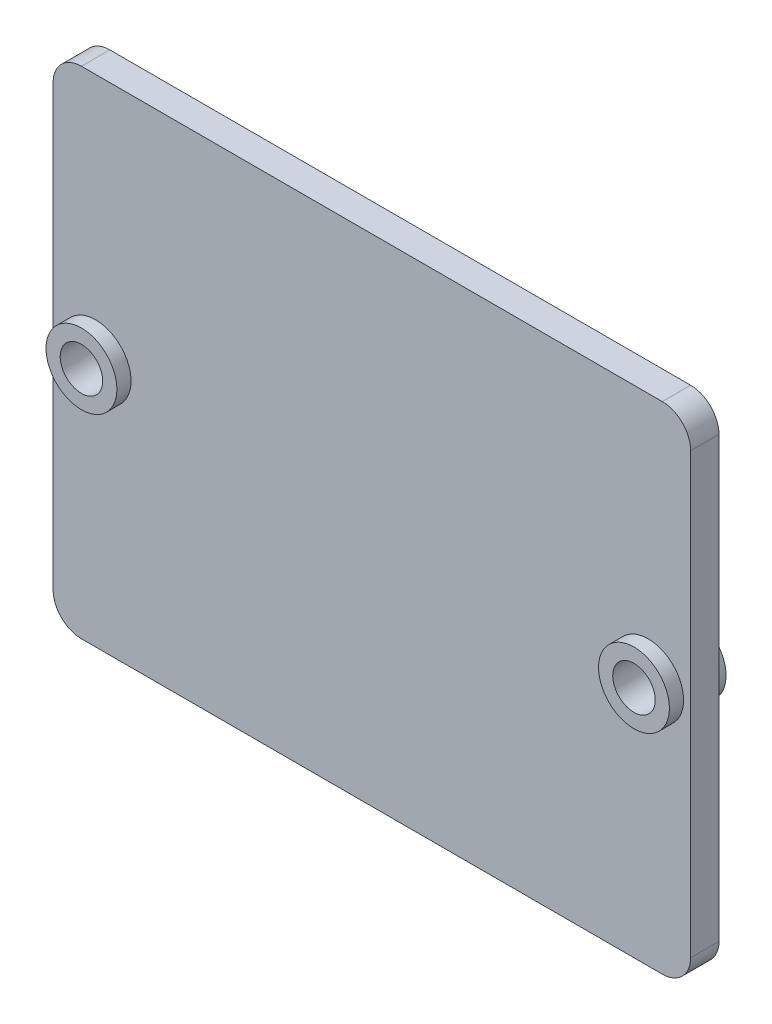
ISO-10303-21;
HEADER;
FILE_DESCRIPTION(('STEP AP214'),'2;1');
FILE_NAME('part.step','',(''),(''),'','','');
FILE_SCHEMA(('AUTOMOTIVE_DESIGN { 1 0 10303 214 1 1 1 1 }'));
ENDSEC;
DATA;
#1=APPLICATION_CONTEXT('core data for automotive mechanical design processes');
#2=APPLICATION_PROTOCOL_DEFINITION('international standard','automotive_design',2000,#1);
#3=PRODUCT_CONTEXT('',#1,'mechanical');
#4=PRODUCT('Part','Part','',(#3));
#5=PRODUCT_RELATED_PRODUCT_CATEGORY('part','',(#4));
#6=PRODUCT_DEFINITION_FORMATION('','',#4);
#7=PRODUCT_DEFINITION_CONTEXT('part definition',#1,'design');
#8=PRODUCT_DEFINITION('design','',#6,#7);
#9=PRODUCT_DEFINITION_SHAPE('','',#8);
#10=(LENGTH_UNIT() NAMED_UNIT(*) SI_UNIT(.MILLI.,.METRE.));
#11=(NAMED_UNIT(*) PLANE_ANGLE_UNIT() SI_UNIT($,.RADIAN.));
#12=(NAMED_UNIT(*) SI_UNIT($,.STERADIAN.) SOLID_ANGLE_UNIT());
#13=UNCERTAINTY_MEASURE_WITH_UNIT(LENGTH_MEASURE(1.E-05),#10,'distance_accuracy_value','');
#14=(GEOMETRIC_REPRESENTATION_CONTEXT(3) GLOBAL_UNCERTAINTY_ASSIGNED_CONTEXT((#13)) GLOBAL_UNIT_ASSIGNED_CONTEXT((#10,
#11,#12)) REPRESENTATION_CONTEXT('',''));
#15=CARTESIAN_POINT('',(0.,0.,0.));
#16=DIRECTION('',(0.,0.,1.));
#17=DIRECTION('',(1.,0.,0.));
#18=AXIS2_PLACEMENT_3D('',#15,#16,#17);
#19=CARTESIAN_POINT('',(0.,0.,20.));
#20=DIRECTION('',(1.,0.,0.));
#21=DIRECTION('',(0.,1.,0.));
#22=AXIS2_PLACEMENT_3D('',#19,#20,#21);
#23=PLANE('',#22);
#24=DIRECTION('',(0.,-1.,0.));
#25=VECTOR('',#24,1.);
#26=CARTESIAN_POINT('',(0.,0.,0.));
#27=LINE('',#26,#25);
#28=CARTESIAN_POINT('',(0.,-20.,0.));
#29=VERTEX_POINT('',#28);
#30=CARTESIAN_POINT('',(0.,-330.,0.));
#31=VERTEX_POINT('',#30);
#32=EDGE_CURVE('E153',#29,#31,#27,.T.);
#33=ORIENTED_EDGE('',*,*,#32,.T.);
#34=DIRECTION('',(0.,0.,-1.));
#35=VECTOR('',#34,1.);
#36=CARTESIAN_POINT('',(0.,-330.,20.));
#37=LINE('',#36,#35);
#38=CARTESIAN_POINT('',(0.,-330.,20.));
#39=VERTEX_POINT('',#38);
#40=EDGE_CURVE('E131',#31,#39,#37,.F.);
#41=ORIENTED_EDGE('',*,*,#40,.T.);
#42=DIRECTION('',(0.,-1.,0.));
#43=VECTOR('',#42,1.);
#44=CARTESIAN_POINT('',(0.,0.,20.));
#45=LINE('',#44,#43);
#46=CARTESIAN_POINT('',(0.,-20.,20.));
#47=VERTEX_POINT('',#46);
#48=EDGE_CURVE('E163',#47,#39,#45,.T.);
#49=ORIENTED_EDGE('',*,*,#48,.F.);
#50=DIRECTION('',(0.,0.,-1.));
#51=VECTOR('',#50,1.);
#52=CARTESIAN_POINT('',(0.,-20.,20.));
#53=LINE('',#52,#51);
#54=EDGE_CURVE('E136',#47,#29,#53,.T.);
#55=ORIENTED_EDGE('',*,*,#54,.T.);
#56=EDGE_LOOP('',(#33,#41,#49,#55));
#57=FACE_BOUND('',#56,.T.);
#58=ADVANCED_FACE('F61',(#57),#23,.F.);
#59=CARTESIAN_POINT('',(0.,-350.,20.));
#60=DIRECTION('',(0.,1.,0.));
#61=DIRECTION('',(0.,0.,1.));
#62=AXIS2_PLACEMENT_3D('',#59,#60,#61);
#63=PLANE('',#62);
#64=DIRECTION('',(1.,0.,0.));
#65=VECTOR('',#64,1.);
#66=CARTESIAN_POINT('',(0.,-350.,20.));
#67=LINE('',#66,#65);
#68=CARTESIAN_POINT('',(20.,-350.,20.));
#69=VERTEX_POINT('',#68);
#70=CARTESIAN_POINT('',(430.,-350.,20.));
#71=VERTEX_POINT('',#70);
#72=EDGE_CURVE('E146',#69,#71,#67,.T.);
#73=ORIENTED_EDGE('',*,*,#72,.F.);
#74=DIRECTION('',(0.,0.,-1.));
#75=VECTOR('',#74,1.);
#76=CARTESIAN_POINT('',(20.,-350.,20.));
#77=LINE('',#76,#75);
#78=CARTESIAN_POINT('',(20.,-350.,0.));
#79=VERTEX_POINT('',#78);
#80=EDGE_CURVE('E130',#69,#79,#77,.T.);
#81=ORIENTED_EDGE('',*,*,#80,.T.);
#82=DIRECTION('',(1.,0.,0.));
#83=VECTOR('',#82,1.);
#84=CARTESIAN_POINT('',(0.,-350.,0.));
#85=LINE('',#84,#83);
#86=CARTESIAN_POINT('',(430.,-350.,0.));
#87=VERTEX_POINT('',#86);
#88=EDGE_CURVE('E143',#79,#87,#85,.T.);
#89=ORIENTED_EDGE('',*,*,#88,.T.);
#90=DIRECTION('',(0.,0.,-1.));
#91=VECTOR('',#90,1.);
#92=CARTESIAN_POINT('',(430.,-350.,20.));
#93=LINE('',#92,#91);
#94=EDGE_CURVE('E148',#87,#71,#93,.F.);
#95=ORIENTED_EDGE('',*,*,#94,.T.);
#96=EDGE_LOOP('',(#73,#81,#89,#95));
#97=FACE_BOUND('',#96,.T.);
#98=ADVANCED_FACE('F142',(#97),#63,.F.);
#99=CARTESIAN_POINT('',(450.,0.,20.));
#100=DIRECTION('',(-1.,0.,0.));
#101=DIRECTION('',(0.,-1.,0.));
#102=AXIS2_PLACEMENT_3D('',#99,#100,#101);
#103=PLANE('',#102);
#104=DIRECTION('',(0.,1.,0.));
#105=VECTOR('',#104,1.);
#106=CARTESIAN_POINT('',(450.,0.,20.));
#107=LINE('',#106,#105);
#108=CARTESIAN_POINT('',(450.,-330.,20.));
#109=VERTEX_POINT('',#108);
#110=CARTESIAN_POINT('',(450.,-20.,20.));
#111=VERTEX_POINT('',#110);
#112=EDGE_CURVE('E206',#109,#111,#107,.T.);
#113=ORIENTED_EDGE('',*,*,#112,.F.);
#114=DIRECTION('',(0.,0.,-1.));
#115=VECTOR('',#114,1.);
#116=CARTESIAN_POINT('',(450.,-330.,20.));
#117=LINE('',#116,#115);
#118=CARTESIAN_POINT('',(450.,-330.,0.));
#119=VERTEX_POINT('',#118);
#120=EDGE_CURVE('E190',#109,#119,#117,.T.);
#121=ORIENTED_EDGE('',*,*,#120,.T.);
#122=DIRECTION('',(0.,1.,0.));
#123=VECTOR('',#122,1.);
#124=CARTESIAN_POINT('',(450.,0.,0.));
#125=LINE('',#124,#123);
#126=CARTESIAN_POINT('',(450.,-20.,0.));
#127=VERTEX_POINT('',#126);
#128=EDGE_CURVE('E152',#119,#127,#125,.T.);
#129=ORIENTED_EDGE('',*,*,#128,.T.);
#130=DIRECTION('',(0.,0.,-1.));
#131=VECTOR('',#130,1.);
#132=CARTESIAN_POINT('',(450.,-20.,20.));
#133=LINE('',#132,#131);
#134=EDGE_CURVE('E188',#127,#111,#133,.F.);
#135=ORIENTED_EDGE('',*,*,#134,.T.);
#136=EDGE_LOOP('',(#113,#121,#129,#135));
#137=FACE_BOUND('',#136,.T.);
#138=ADVANCED_FACE('F255',(#137),#103,.F.);
#139=CARTESIAN_POINT('',(0.,0.,20.));
#140=DIRECTION('',(0.,-1.,0.));
#141=DIRECTION('',(0.,0.,-1.));
#142=AXIS2_PLACEMENT_3D('',#139,#140,#141);
#143=PLANE('',#142);
#144=DIRECTION('',(-1.,0.,0.));
#145=VECTOR('',#144,1.);
#146=CARTESIAN_POINT('',(0.,0.,0.));
#147=LINE('',#146,#145);
#148=CARTESIAN_POINT('',(430.,0.,0.));
#149=VERTEX_POINT('',#148);
#150=CARTESIAN_POINT('',(20.,0.,0.));
#151=VERTEX_POINT('',#150);
#152=EDGE_CURVE('E156',#149,#151,#147,.T.);
#153=ORIENTED_EDGE('',*,*,#152,.T.);
#154=DIRECTION('',(0.,0.,-1.));
#155=VECTOR('',#154,1.);
#156=CARTESIAN_POINT('',(20.,0.,20.));
#157=LINE('',#156,#155);
#158=CARTESIAN_POINT('',(20.,0.,20.));
#159=VERTEX_POINT('',#158);
#160=EDGE_CURVE('E12',#151,#159,#157,.F.);
#161=ORIENTED_EDGE('',*,*,#160,.T.);
#162=DIRECTION('',(-1.,0.,0.));
#163=VECTOR('',#162,1.);
#164=CARTESIAN_POINT('',(0.,0.,20.));
#165=LINE('',#164,#163);
#166=CARTESIAN_POINT('',(430.,0.,20.));
#167=VERTEX_POINT('',#166);
#168=EDGE_CURVE('E196',#167,#159,#165,.T.);
#169=ORIENTED_EDGE('',*,*,#168,.F.);
#170=DIRECTION('',(0.,0.,-1.));
#171=VECTOR('',#170,1.);
#172=CARTESIAN_POINT('',(430.,0.,20.));
#173=LINE('',#172,#171);
#174=EDGE_CURVE('E69',#167,#149,#173,.T.);
#175=ORIENTED_EDGE('',*,*,#174,.T.);
#176=EDGE_LOOP('',(#153,#161,#169,#175));
#177=FACE_BOUND('',#176,.T.);
#178=ADVANCED_FACE('F195',(#177),#143,.F.);
#179=CARTESIAN_POINT('',(0.,0.,20.));
#180=DIRECTION('',(0.,0.,1.));
#181=DIRECTION('',(1.,0.,0.));
#182=AXIS2_PLACEMENT_3D('',#179,#180,#181);
#183=PLANE('',#182);
#184=CARTESIAN_POINT('',(30.,-175.,20.));
#185=DIRECTION('',(0.,0.,1.));
#186=DIRECTION('',(1.,0.,0.));
#187=AXIS2_PLACEMENT_3D('',#184,#185,#186);
#188=CIRCLE('',#187,25.);
#189=CARTESIAN_POINT('',(55.,-175.,20.));
#190=VERTEX_POINT('',#189);
#191=EDGE_CURVE('E172',#190,#190,#188,.T.);
#192=ORIENTED_EDGE('',*,*,#191,.F.);
#193=EDGE_LOOP('',(#192));
#194=FACE_BOUND('',#193,.T.);
#195=CARTESIAN_POINT('',(420.,-175.,20.));
#196=DIRECTION('',(0.,0.,1.));
#197=DIRECTION('',(1.,0.,0.));
#198=AXIS2_PLACEMENT_3D('',#195,#196,#197);
#199=CIRCLE('',#198,25.);
#200=CARTESIAN_POINT('',(445.,-175.,20.));
#201=VERTEX_POINT('',#200);
#202=EDGE_CURVE('E209',#201,#201,#199,.T.);
#203=ORIENTED_EDGE('',*,*,#202,.F.);
#204=EDGE_LOOP('',(#203));
#205=FACE_BOUND('',#204,.T.);
#206=ORIENTED_EDGE('',*,*,#48,.T.);
#207=CARTESIAN_POINT('',(20.,-330.,20.));
#208=DIRECTION('',(0.,0.,1.));
#209=DIRECTION('',(1.,0.,0.));
#210=AXIS2_PLACEMENT_3D('',#207,#208,#209);
#211=CIRCLE('',#210,20.);
#212=EDGE_CURVE('E186',#39,#69,#211,.T.);
#213=ORIENTED_EDGE('',*,*,#212,.T.);
#214=ORIENTED_EDGE('',*,*,#72,.T.);
#215=CARTESIAN_POINT('',(430.,-330.,20.));
#216=DIRECTION('',(0.,0.,1.));
#217=DIRECTION('',(1.,0.,0.));
#218=AXIS2_PLACEMENT_3D('',#215,#216,#217);
#219=CIRCLE('',#218,20.);
#220=EDGE_CURVE('E184',#71,#109,#219,.T.);
#221=ORIENTED_EDGE('',*,*,#220,.T.);
#222=ORIENTED_EDGE('',*,*,#112,.T.);
#223=CARTESIAN_POINT('',(430.,-20.,20.));
#224=DIRECTION('',(0.,0.,1.));
#225=DIRECTION('',(1.,0.,0.));
#226=AXIS2_PLACEMENT_3D('',#223,#224,#225);
#227=CIRCLE('',#226,20.);
#228=EDGE_CURVE('E81',#111,#167,#227,.T.);
#229=ORIENTED_EDGE('',*,*,#228,.T.);
#230=ORIENTED_EDGE('',*,*,#168,.T.);
#231=CARTESIAN_POINT('',(20.,-20.,20.));
#232=DIRECTION('',(0.,0.,1.));
#233=DIRECTION('',(1.,0.,0.));
#234=AXIS2_PLACEMENT_3D('',#231,#232,#233);
#235=CIRCLE('',#234,20.);
#236=EDGE_CURVE('E182',#159,#47,#235,.T.);
#237=ORIENTED_EDGE('',*,*,#236,.T.);
#238=EDGE_LOOP('',(#206,#213,#214,#221,#222,#229,#230,#237));
#239=FACE_BOUND('',#238,.T.);
#240=ADVANCED_FACE('F275',(#194,#205,#239),#183,.T.);
#241=CARTESIAN_POINT('',(0.,0.,0.));
#242=DIRECTION('',(0.,0.,1.));
#243=DIRECTION('',(1.,0.,0.));
#244=AXIS2_PLACEMENT_3D('',#241,#242,#243);
#245=PLANE('',#244);
#246=CARTESIAN_POINT('',(30.,-175.,0.));
#247=DIRECTION('',(0.,0.,1.));
#248=DIRECTION('',(1.,0.,0.));
#249=AXIS2_PLACEMENT_3D('',#246,#247,#248);
#250=CIRCLE('',#249,25.);
#251=CARTESIAN_POINT('',(55.,-175.,0.));
#252=VERTEX_POINT('',#251);
#253=EDGE_CURVE('E167',#252,#252,#250,.T.);
#254=ORIENTED_EDGE('',*,*,#253,.T.);
#255=EDGE_LOOP('',(#254));
#256=FACE_BOUND('',#255,.T.);
#257=CARTESIAN_POINT('',(420.,-175.,0.));
#258=DIRECTION('',(0.,0.,1.));
#259=DIRECTION('',(1.,0.,0.));
#260=AXIS2_PLACEMENT_3D('',#257,#258,#259);
#261=CIRCLE('',#260,25.);
#262=CARTESIAN_POINT('',(445.,-175.,0.));
#263=VERTEX_POINT('',#262);
#264=EDGE_CURVE('E158',#263,#263,#261,.T.);
#265=ORIENTED_EDGE('',*,*,#264,.T.);
#266=EDGE_LOOP('',(#265));
#267=FACE_BOUND('',#266,.T.);
#268=ORIENTED_EDGE('',*,*,#88,.F.);
#269=CARTESIAN_POINT('',(20.,-330.,0.));
#270=DIRECTION('',(0.,0.,1.));
#271=DIRECTION('',(1.,0.,0.));
#272=AXIS2_PLACEMENT_3D('',#269,#270,#271);
#273=CIRCLE('',#272,20.);
#274=EDGE_CURVE('E126',#79,#31,#273,.F.);
#275=ORIENTED_EDGE('',*,*,#274,.T.);
#276=ORIENTED_EDGE('',*,*,#32,.F.);
#277=CARTESIAN_POINT('',(20.,-20.,0.));
#278=DIRECTION('',(0.,0.,1.));
#279=DIRECTION('',(1.,0.,0.));
#280=AXIS2_PLACEMENT_3D('',#277,#278,#279);
#281=CIRCLE('',#280,20.);
#282=EDGE_CURVE('E175',#29,#151,#281,.F.);
#283=ORIENTED_EDGE('',*,*,#282,.T.);
#284=ORIENTED_EDGE('',*,*,#152,.F.);
#285=CARTESIAN_POINT('',(430.,-20.,0.));
#286=DIRECTION('',(0.,0.,1.));
#287=DIRECTION('',(1.,0.,0.));
#288=AXIS2_PLACEMENT_3D('',#285,#286,#287);
#289=CIRCLE('',#288,20.);
#290=EDGE_CURVE('E147',#149,#127,#289,.F.);
#291=ORIENTED_EDGE('',*,*,#290,.T.);
#292=ORIENTED_EDGE('',*,*,#128,.F.);
#293=CARTESIAN_POINT('',(430.,-330.,0.));
#294=DIRECTION('',(0.,0.,1.));
#295=DIRECTION('',(1.,0.,0.));
#296=AXIS2_PLACEMENT_3D('',#293,#294,#295);
#297=CIRCLE('',#296,20.);
#298=EDGE_CURVE('E137',#119,#87,#297,.F.);
#299=ORIENTED_EDGE('',*,*,#298,.T.);
#300=EDGE_LOOP('',(#268,#275,#276,#283,#284,#291,#292,#299));
#301=FACE_BOUND('',#300,.T.);
#302=ADVANCED_FACE('F150',(#256,#267,#301),#245,.F.);
#303=CARTESIAN_POINT('',(420.,-175.,30.));
#304=DIRECTION('',(0.,0.,-1.));
#305=DIRECTION('',(-1.,0.,0.));
#306=AXIS2_PLACEMENT_3D('',#303,#304,#305);
#307=CYLINDRICAL_SURFACE('',#306,25.);
#308=CARTESIAN_POINT('',(420.,-175.,-10.));
#309=DIRECTION('',(0.,0.,-1.));
#310=DIRECTION('',(-1.,0.,0.));
#311=AXIS2_PLACEMENT_3D('',#308,#309,#310);
#312=CIRCLE('',#311,25.);
#313=CARTESIAN_POINT('',(395.,-175.,-10.));
#314=VERTEX_POINT('',#313);
#315=EDGE_CURVE('E224',#314,#314,#312,.T.);
#316=ORIENTED_EDGE('',*,*,#315,.F.);
#317=EDGE_LOOP('',(#316));
#318=FACE_BOUND('',#317,.T.);
#319=ORIENTED_EDGE('',*,*,#264,.F.);
#320=EDGE_LOOP('',(#319));
#321=FACE_BOUND('',#320,.T.);
#322=ADVANCED_FACE('F248',(#318,#321),#307,.T.);
#323=CARTESIAN_POINT('',(420.,-175.,-10.));
#324=DIRECTION('',(0.,0.,-1.));
#325=DIRECTION('',(-1.,0.,0.));
#326=AXIS2_PLACEMENT_3D('',#323,#324,#325);
#327=PLANE('',#326);
#328=ORIENTED_EDGE('',*,*,#315,.T.);
#329=EDGE_LOOP('',(#328));
#330=FACE_BOUND('',#329,.T.);
#331=CARTESIAN_POINT('',(420.,-175.,-10.));
#332=DIRECTION('',(0.,0.,-1.));
#333=DIRECTION('',(-1.,0.,0.));
#334=AXIS2_PLACEMENT_3D('',#331,#332,#333);
#335=CIRCLE('',#334,15.);
#336=CARTESIAN_POINT('',(405.,-175.,-10.));
#337=VERTEX_POINT('',#336);
#338=EDGE_CURVE('E170',#337,#337,#335,.T.);
#339=ORIENTED_EDGE('',*,*,#338,.F.);
#340=EDGE_LOOP('',(#339));
#341=FACE_BOUND('',#340,.T.);
#342=ADVANCED_FACE('F246',(#330,#341),#327,.T.);
#343=ORIENTED_EDGE('',*,*,#202,.T.);
#344=EDGE_LOOP('',(#343));
#345=FACE_BOUND('',#344,.T.);
#346=CARTESIAN_POINT('',(420.,-175.,30.));
#347=DIRECTION('',(0.,0.,-1.));
#348=DIRECTION('',(-1.,0.,0.));
#349=AXIS2_PLACEMENT_3D('',#346,#347,#348);
#350=CIRCLE('',#349,25.);
#351=CARTESIAN_POINT('',(395.,-175.,30.));
#352=VERTEX_POINT('',#351);
#353=EDGE_CURVE('E166',#352,#352,#350,.T.);
#354=ORIENTED_EDGE('',*,*,#353,.T.);
#355=EDGE_LOOP('',(#354));
#356=FACE_BOUND('',#355,.T.);
#357=ADVANCED_FACE('F232',(#345,#356),#307,.T.);
#358=CARTESIAN_POINT('',(420.,-175.,30.));
#359=DIRECTION('',(0.,0.,-1.));
#360=DIRECTION('',(-1.,0.,0.));
#361=AXIS2_PLACEMENT_3D('',#358,#359,#360);
#362=PLANE('',#361);
#363=CARTESIAN_POINT('',(420.,-175.,30.));
#364=DIRECTION('',(0.,0.,-1.));
#365=DIRECTION('',(-1.,0.,0.));
#366=AXIS2_PLACEMENT_3D('',#363,#364,#365);
#367=CIRCLE('',#366,15.);
#368=CARTESIAN_POINT('',(405.,-175.,30.));
#369=VERTEX_POINT('',#368);
#370=EDGE_CURVE('E227',#369,#369,#367,.T.);
#371=ORIENTED_EDGE('',*,*,#370,.T.);
#372=EDGE_LOOP('',(#371));
#373=FACE_BOUND('',#372,.T.);
#374=ORIENTED_EDGE('',*,*,#353,.F.);
#375=EDGE_LOOP('',(#374));
#376=FACE_BOUND('',#375,.T.);
#377=ADVANCED_FACE('F234',(#373,#376),#362,.F.);
#378=CARTESIAN_POINT('',(420.,-175.,25.));
#379=DIRECTION('',(0.,0.,-1.));
#380=DIRECTION('',(-1.,0.,0.));
#381=AXIS2_PLACEMENT_3D('',#378,#379,#380);
#382=CYLINDRICAL_SURFACE('',#381,15.);
#383=ORIENTED_EDGE('',*,*,#338,.T.);
#384=EDGE_LOOP('',(#383));
#385=FACE_BOUND('',#384,.T.);
#386=ORIENTED_EDGE('',*,*,#370,.F.);
#387=EDGE_LOOP('',(#386));
#388=FACE_BOUND('',#387,.T.);
#389=ADVANCED_FACE('F236',(#385,#388),#382,.F.);
#390=CARTESIAN_POINT('',(30.,-175.,30.));
#391=DIRECTION('',(0.,0.,-1.));
#392=DIRECTION('',(-1.,0.,0.));
#393=AXIS2_PLACEMENT_3D('',#390,#391,#392);
#394=CYLINDRICAL_SURFACE('',#393,25.);
#395=CARTESIAN_POINT('',(30.,-175.,-10.));
#396=DIRECTION('',(0.,0.,-1.));
#397=DIRECTION('',(-1.,0.,0.));
#398=AXIS2_PLACEMENT_3D('',#395,#396,#397);
#399=CIRCLE('',#398,25.);
#400=CARTESIAN_POINT('',(5.,-175.,-10.));
#401=VERTEX_POINT('',#400);
#402=EDGE_CURVE('E426',#401,#401,#399,.T.);
#403=ORIENTED_EDGE('',*,*,#402,.F.);
#404=EDGE_LOOP('',(#403));
#405=FACE_BOUND('',#404,.T.);
#406=ORIENTED_EDGE('',*,*,#253,.F.);
#407=EDGE_LOOP('',(#406));
#408=FACE_BOUND('',#407,.T.);
#409=ADVANCED_FACE('F243',(#405,#408),#394,.T.);
#410=CARTESIAN_POINT('',(30.,-175.,-10.));
#411=DIRECTION('',(0.,0.,-1.));
#412=DIRECTION('',(-1.,0.,0.));
#413=AXIS2_PLACEMENT_3D('',#410,#411,#412);
#414=PLANE('',#413);
#415=ORIENTED_EDGE('',*,*,#402,.T.);
#416=EDGE_LOOP('',(#415));
#417=FACE_BOUND('',#416,.T.);
#418=CARTESIAN_POINT('',(30.,-175.,-10.));
#419=DIRECTION('',(0.,0.,-1.));
#420=DIRECTION('',(-1.,0.,0.));
#421=AXIS2_PLACEMENT_3D('',#418,#419,#420);
#422=CIRCLE('',#421,15.);
#423=CARTESIAN_POINT('',(15.,-175.,-10.));
#424=VERTEX_POINT('',#423);
#425=EDGE_CURVE('E171',#424,#424,#422,.T.);
#426=ORIENTED_EDGE('',*,*,#425,.F.);
#427=EDGE_LOOP('',(#426));
#428=FACE_BOUND('',#427,.T.);
#429=ADVANCED_FACE('F353',(#417,#428),#414,.T.);
#430=ORIENTED_EDGE('',*,*,#191,.T.);
#431=EDGE_LOOP('',(#430));
#432=FACE_BOUND('',#431,.T.);
#433=CARTESIAN_POINT('',(30.,-175.,30.));
#434=DIRECTION('',(0.,0.,-1.));
#435=DIRECTION('',(-1.,0.,0.));
#436=AXIS2_PLACEMENT_3D('',#433,#434,#435);
#437=CIRCLE('',#436,25.);
#438=CARTESIAN_POINT('',(5.,-175.,30.));
#439=VERTEX_POINT('',#438);
#440=EDGE_CURVE('E431',#439,#439,#437,.T.);
#441=ORIENTED_EDGE('',*,*,#440,.T.);
#442=EDGE_LOOP('',(#441));
#443=FACE_BOUND('',#442,.T.);
#444=ADVANCED_FACE('F345',(#432,#443),#394,.T.);
#445=CARTESIAN_POINT('',(30.,-175.,30.));
#446=DIRECTION('',(0.,0.,-1.));
#447=DIRECTION('',(-1.,0.,0.));
#448=AXIS2_PLACEMENT_3D('',#445,#446,#447);
#449=PLANE('',#448);
#450=CARTESIAN_POINT('',(30.,-175.,30.));
#451=DIRECTION('',(0.,0.,-1.));
#452=DIRECTION('',(-1.,0.,0.));
#453=AXIS2_PLACEMENT_3D('',#450,#451,#452);
#454=CIRCLE('',#453,15.);
#455=CARTESIAN_POINT('',(15.,-175.,30.));
#456=VERTEX_POINT('',#455);
#457=EDGE_CURVE('E428',#456,#456,#454,.T.);
#458=ORIENTED_EDGE('',*,*,#457,.T.);
#459=EDGE_LOOP('',(#458));
#460=FACE_BOUND('',#459,.T.);
#461=ORIENTED_EDGE('',*,*,#440,.F.);
#462=EDGE_LOOP('',(#461));
#463=FACE_BOUND('',#462,.T.);
#464=ADVANCED_FACE('F339',(#460,#463),#449,.F.);
#465=CARTESIAN_POINT('',(30.,-175.,25.));
#466=DIRECTION('',(0.,0.,-1.));
#467=DIRECTION('',(-1.,0.,0.));
#468=AXIS2_PLACEMENT_3D('',#465,#466,#467);
#469=CYLINDRICAL_SURFACE('',#468,15.);
#470=ORIENTED_EDGE('',*,*,#425,.T.);
#471=EDGE_LOOP('',(#470));
#472=FACE_BOUND('',#471,.T.);
#473=ORIENTED_EDGE('',*,*,#457,.F.);
#474=EDGE_LOOP('',(#473));
#475=FACE_BOUND('',#474,.T.);
#476=ADVANCED_FACE('F262',(#472,#475),#469,.F.);
#477=CARTESIAN_POINT('',(20.,-330.,20.));
#478=DIRECTION('',(0.,0.,-1.));
#479=DIRECTION('',(-1.,0.,0.));
#480=AXIS2_PLACEMENT_3D('',#477,#478,#479);
#481=CYLINDRICAL_SURFACE('',#480,20.);
#482=ORIENTED_EDGE('',*,*,#212,.F.);
#483=ORIENTED_EDGE('',*,*,#40,.F.);
#484=ORIENTED_EDGE('',*,*,#274,.F.);
#485=ORIENTED_EDGE('',*,*,#80,.F.);
#486=EDGE_LOOP('',(#482,#483,#484,#485));
#487=FACE_BOUND('',#486,.T.);
#488=ADVANCED_FACE('F129',(#487),#481,.T.);
#489=CARTESIAN_POINT('',(430.,-330.,20.));
#490=DIRECTION('',(0.,0.,-1.));
#491=DIRECTION('',(-1.,0.,0.));
#492=AXIS2_PLACEMENT_3D('',#489,#490,#491);
#493=CYLINDRICAL_SURFACE('',#492,20.);
#494=ORIENTED_EDGE('',*,*,#220,.F.);
#495=ORIENTED_EDGE('',*,*,#94,.F.);
#496=ORIENTED_EDGE('',*,*,#298,.F.);
#497=ORIENTED_EDGE('',*,*,#120,.F.);
#498=EDGE_LOOP('',(#494,#495,#496,#497));
#499=FACE_BOUND('',#498,.T.);
#500=ADVANCED_FACE('F261',(#499),#493,.T.);
#501=CARTESIAN_POINT('',(20.,-20.,20.));
#502=DIRECTION('',(0.,0.,-1.));
#503=DIRECTION('',(-1.,0.,0.));
#504=AXIS2_PLACEMENT_3D('',#501,#502,#503);
#505=CYLINDRICAL_SURFACE('',#504,20.);
#506=ORIENTED_EDGE('',*,*,#236,.F.);
#507=ORIENTED_EDGE('',*,*,#160,.F.);
#508=ORIENTED_EDGE('',*,*,#282,.F.);
#509=ORIENTED_EDGE('',*,*,#54,.F.);
#510=EDGE_LOOP('',(#506,#507,#508,#509));
#511=FACE_BOUND('',#510,.T.);
#512=ADVANCED_FACE('F201',(#511),#505,.T.);
#513=CARTESIAN_POINT('',(430.,-20.,20.));
#514=DIRECTION('',(0.,0.,-1.));
#515=DIRECTION('',(-1.,0.,0.));
#516=AXIS2_PLACEMENT_3D('',#513,#514,#515);
#517=CYLINDRICAL_SURFACE('',#516,20.);
#518=ORIENTED_EDGE('',*,*,#228,.F.);
#519=ORIENTED_EDGE('',*,*,#134,.F.);
#520=ORIENTED_EDGE('',*,*,#290,.F.);
#521=ORIENTED_EDGE('',*,*,#174,.F.);
#522=EDGE_LOOP('',(#518,#519,#520,#521));
#523=FACE_BOUND('',#522,.T.);
#524=ADVANCED_FACE('F63',(#523),#517,.T.);
#525=CLOSED_SHELL('',(#58,#98,#138,#178,#240,#302,#322,#342,#357,#377,#389,#409,#429,#444,#464,
#476,#488,#500,#512,#524));
#526=MANIFOLD_SOLID_BREP('B2',#525);
#527=ADVANCED_BREP_SHAPE_REPRESENTATION('',(#18,#526),#14);
#528=SHAPE_DEFINITION_REPRESENTATION(#9,#527);
ENDSEC;
END-ISO-10303-21;
